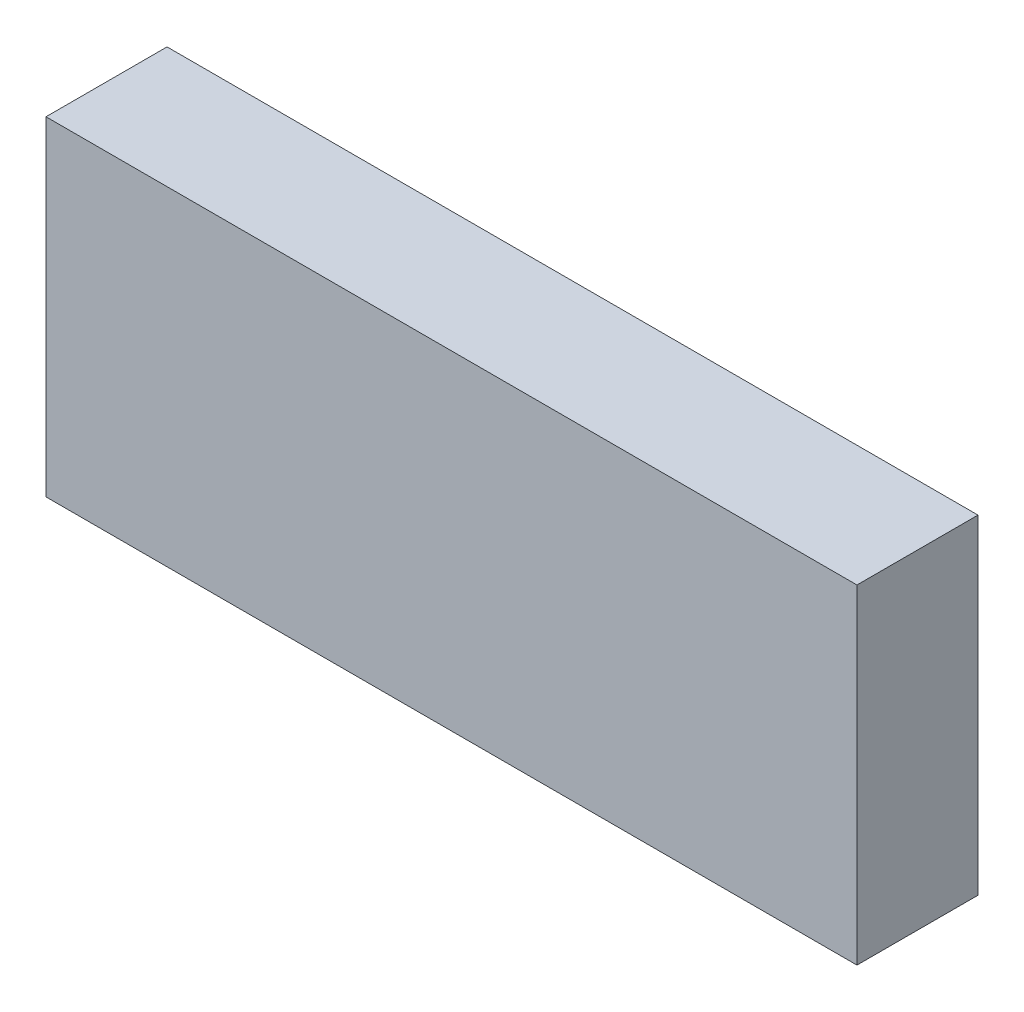
ISO-10303-21;
HEADER;
FILE_DESCRIPTION(('STEP AP214'),'2;1');
FILE_NAME('part.step','',(''),(''),'','','');
FILE_SCHEMA(('AUTOMOTIVE_DESIGN { 1 0 10303 214 1 1 1 1 }'));
ENDSEC;
DATA;
#1=APPLICATION_CONTEXT('core data for automotive mechanical design processes');
#2=APPLICATION_PROTOCOL_DEFINITION('international standard','automotive_design',2000,#1);
#3=PRODUCT_CONTEXT('',#1,'mechanical');
#4=PRODUCT('Part','Part','',(#3));
#5=PRODUCT_RELATED_PRODUCT_CATEGORY('part','',(#4));
#6=PRODUCT_DEFINITION_FORMATION('','',#4);
#7=PRODUCT_DEFINITION_CONTEXT('part definition',#1,'design');
#8=PRODUCT_DEFINITION('design','',#6,#7);
#9=PRODUCT_DEFINITION_SHAPE('','',#8);
#10=(LENGTH_UNIT() NAMED_UNIT(*) SI_UNIT(.MILLI.,.METRE.));
#11=(NAMED_UNIT(*) PLANE_ANGLE_UNIT() SI_UNIT($,.RADIAN.));
#12=(NAMED_UNIT(*) SI_UNIT($,.STERADIAN.) SOLID_ANGLE_UNIT());
#13=UNCERTAINTY_MEASURE_WITH_UNIT(LENGTH_MEASURE(1.E-05),#10,'distance_accuracy_value','');
#14=(GEOMETRIC_REPRESENTATION_CONTEXT(3) GLOBAL_UNCERTAINTY_ASSIGNED_CONTEXT((#13)) GLOBAL_UNIT_ASSIGNED_CONTEXT((#10,
#11,#12)) REPRESENTATION_CONTEXT('',''));
#15=CARTESIAN_POINT('',(0.,0.,0.));
#16=DIRECTION('',(0.,0.,1.));
#17=DIRECTION('',(1.,0.,0.));
#18=AXIS2_PLACEMENT_3D('',#15,#16,#17);
#19=CARTESIAN_POINT('',(6.6,-13.6,-50.2));
#20=DIRECTION('',(0.,0.,-1.));
#21=DIRECTION('',(-1.,0.,0.));
#22=AXIS2_PLACEMENT_3D('',#19,#20,#21);
#23=PLANE('',#22);
#24=DIRECTION('',(0.,1.,0.));
#25=VECTOR('',#24,1.);
#26=CARTESIAN_POINT('',(6.6,-13.6,-50.2));
#27=LINE('',#26,#25);
#28=CARTESIAN_POINT('',(6.6,0.,-50.2));
#29=VERTEX_POINT('',#28);
#30=CARTESIAN_POINT('',(6.6,-13.6,-50.2));
#31=VERTEX_POINT('',#30);
#32=EDGE_CURVE('E20',#29,#31,#27,.F.);
#33=ORIENTED_EDGE('',*,*,#32,.T.);
#34=DIRECTION('',(1.,0.,0.));
#35=VECTOR('',#34,1.);
#36=CARTESIAN_POINT('',(6.6,-13.6,-50.2));
#37=LINE('',#36,#35);
#38=CARTESIAN_POINT('',(40.1,-13.6,-50.2));
#39=VERTEX_POINT('',#38);
#40=EDGE_CURVE('E55',#39,#31,#37,.F.);
#41=ORIENTED_EDGE('',*,*,#40,.F.);
#42=DIRECTION('',(0.,1.,0.));
#43=VECTOR('',#42,1.);
#44=CARTESIAN_POINT('',(40.1,-13.6,-50.2));
#45=LINE('',#44,#43);
#46=CARTESIAN_POINT('',(40.1,0.,-50.2));
#47=VERTEX_POINT('',#46);
#48=EDGE_CURVE('E76',#39,#47,#45,.T.);
#49=ORIENTED_EDGE('',*,*,#48,.T.);
#50=DIRECTION('',(1.,0.,0.));
#51=VECTOR('',#50,1.);
#52=CARTESIAN_POINT('',(6.6,0.,-50.2));
#53=LINE('',#52,#51);
#54=EDGE_CURVE('E58',#47,#29,#53,.F.);
#55=ORIENTED_EDGE('',*,*,#54,.T.);
#56=EDGE_LOOP('',(#33,#41,#49,#55));
#57=FACE_BOUND('',#56,.T.);
#58=ADVANCED_FACE('F17',(#57),#23,.F.);
#59=CARTESIAN_POINT('',(6.6,-13.6,-50.2));
#60=DIRECTION('',(1.,0.,0.));
#61=DIRECTION('',(0.,0.,-1.));
#62=AXIS2_PLACEMENT_3D('',#59,#60,#61);
#63=PLANE('',#62);
#64=DIRECTION('',(0.,1.,0.));
#65=VECTOR('',#64,1.);
#66=CARTESIAN_POINT('',(6.6,-13.6,-55.2));
#67=LINE('',#66,#65);
#68=CARTESIAN_POINT('',(6.6,0.,-55.2));
#69=VERTEX_POINT('',#68);
#70=CARTESIAN_POINT('',(6.6,-13.6,-55.2));
#71=VERTEX_POINT('',#70);
#72=EDGE_CURVE('E73',#69,#71,#67,.F.);
#73=ORIENTED_EDGE('',*,*,#72,.T.);
#74=DIRECTION('',(0.,0.,-1.));
#75=VECTOR('',#74,1.);
#76=CARTESIAN_POINT('',(6.6,-13.6,-55.2));
#77=LINE('',#76,#75);
#78=EDGE_CURVE('E63',#31,#71,#77,.T.);
#79=ORIENTED_EDGE('',*,*,#78,.F.);
#80=ORIENTED_EDGE('',*,*,#32,.F.);
#81=DIRECTION('',(0.,0.,-1.));
#82=VECTOR('',#81,1.);
#83=CARTESIAN_POINT('',(6.6,0.,-55.2));
#84=LINE('',#83,#82);
#85=EDGE_CURVE('E80',#29,#69,#84,.T.);
#86=ORIENTED_EDGE('',*,*,#85,.T.);
#87=EDGE_LOOP('',(#73,#79,#80,#86));
#88=FACE_BOUND('',#87,.T.);
#89=ADVANCED_FACE('F72',(#88),#63,.F.);
#90=CARTESIAN_POINT('',(6.6,-13.6,-55.2));
#91=DIRECTION('',(0.,-1.,0.));
#92=DIRECTION('',(0.,0.,-1.));
#93=AXIS2_PLACEMENT_3D('',#90,#91,#92);
#94=PLANE('',#93);
#95=DIRECTION('',(0.,0.,1.));
#96=VECTOR('',#95,1.);
#97=CARTESIAN_POINT('',(40.1,-13.6,-50.2));
#98=LINE('',#97,#96);
#99=CARTESIAN_POINT('',(40.1,-13.6,-55.2));
#100=VERTEX_POINT('',#99);
#101=EDGE_CURVE('E69',#100,#39,#98,.T.);
#102=ORIENTED_EDGE('',*,*,#101,.T.);
#103=ORIENTED_EDGE('',*,*,#40,.T.);
#104=ORIENTED_EDGE('',*,*,#78,.T.);
#105=DIRECTION('',(1.,0.,0.));
#106=VECTOR('',#105,1.);
#107=CARTESIAN_POINT('',(6.6,-13.6,-55.2));
#108=LINE('',#107,#106);
#109=EDGE_CURVE('E83',#71,#100,#108,.T.);
#110=ORIENTED_EDGE('',*,*,#109,.T.);
#111=EDGE_LOOP('',(#102,#103,#104,#110));
#112=FACE_BOUND('',#111,.T.);
#113=ADVANCED_FACE('F66',(#112),#94,.T.);
#114=CARTESIAN_POINT('',(40.1,-13.6,-50.2));
#115=DIRECTION('',(-1.,0.,0.));
#116=DIRECTION('',(0.,0.,1.));
#117=AXIS2_PLACEMENT_3D('',#114,#115,#116);
#118=PLANE('',#117);
#119=ORIENTED_EDGE('',*,*,#48,.F.);
#120=ORIENTED_EDGE('',*,*,#101,.F.);
#121=DIRECTION('',(0.,1.,0.));
#122=VECTOR('',#121,1.);
#123=CARTESIAN_POINT('',(40.1,-13.6,-55.2));
#124=LINE('',#123,#122);
#125=CARTESIAN_POINT('',(40.1,0.,-55.2));
#126=VERTEX_POINT('',#125);
#127=EDGE_CURVE('E26',#100,#126,#124,.T.);
#128=ORIENTED_EDGE('',*,*,#127,.T.);
#129=DIRECTION('',(0.,0.,-1.));
#130=VECTOR('',#129,1.);
#131=CARTESIAN_POINT('',(40.1,0.,-55.2));
#132=LINE('',#131,#130);
#133=EDGE_CURVE('E34',#126,#47,#132,.F.);
#134=ORIENTED_EDGE('',*,*,#133,.T.);
#135=EDGE_LOOP('',(#119,#120,#128,#134));
#136=FACE_BOUND('',#135,.T.);
#137=ADVANCED_FACE('F88',(#136),#118,.F.);
#138=CARTESIAN_POINT('',(6.6,0.,-55.2));
#139=DIRECTION('',(0.,-1.,0.));
#140=DIRECTION('',(0.,0.,-1.));
#141=AXIS2_PLACEMENT_3D('',#138,#139,#140);
#142=PLANE('',#141);
#143=ORIENTED_EDGE('',*,*,#54,.F.);
#144=ORIENTED_EDGE('',*,*,#133,.F.);
#145=DIRECTION('',(1.,0.,0.));
#146=VECTOR('',#145,1.);
#147=CARTESIAN_POINT('',(6.6,0.,-55.2));
#148=LINE('',#147,#146);
#149=EDGE_CURVE('E11',#126,#69,#148,.F.);
#150=ORIENTED_EDGE('',*,*,#149,.T.);
#151=ORIENTED_EDGE('',*,*,#85,.F.);
#152=EDGE_LOOP('',(#143,#144,#150,#151));
#153=FACE_BOUND('',#152,.T.);
#154=ADVANCED_FACE('F91',(#153),#142,.F.);
#155=CARTESIAN_POINT('',(6.6,-13.6,-55.2));
#156=DIRECTION('',(0.,0.,1.));
#157=DIRECTION('',(1.,0.,0.));
#158=AXIS2_PLACEMENT_3D('',#155,#156,#157);
#159=PLANE('',#158);
#160=ORIENTED_EDGE('',*,*,#127,.F.);
#161=ORIENTED_EDGE('',*,*,#109,.F.);
#162=ORIENTED_EDGE('',*,*,#72,.F.);
#163=ORIENTED_EDGE('',*,*,#149,.F.);
#164=EDGE_LOOP('',(#160,#161,#162,#163));
#165=FACE_BOUND('',#164,.T.);
#166=ADVANCED_FACE('F90',(#165),#159,.F.);
#167=CLOSED_SHELL('',(#58,#89,#113,#137,#154,#166));
#168=MANIFOLD_SOLID_BREP('B1',#167);
#169=ADVANCED_BREP_SHAPE_REPRESENTATION('',(#18,#168),#14);
#170=SHAPE_DEFINITION_REPRESENTATION(#9,#169);
ENDSEC;
END-ISO-10303-21;
